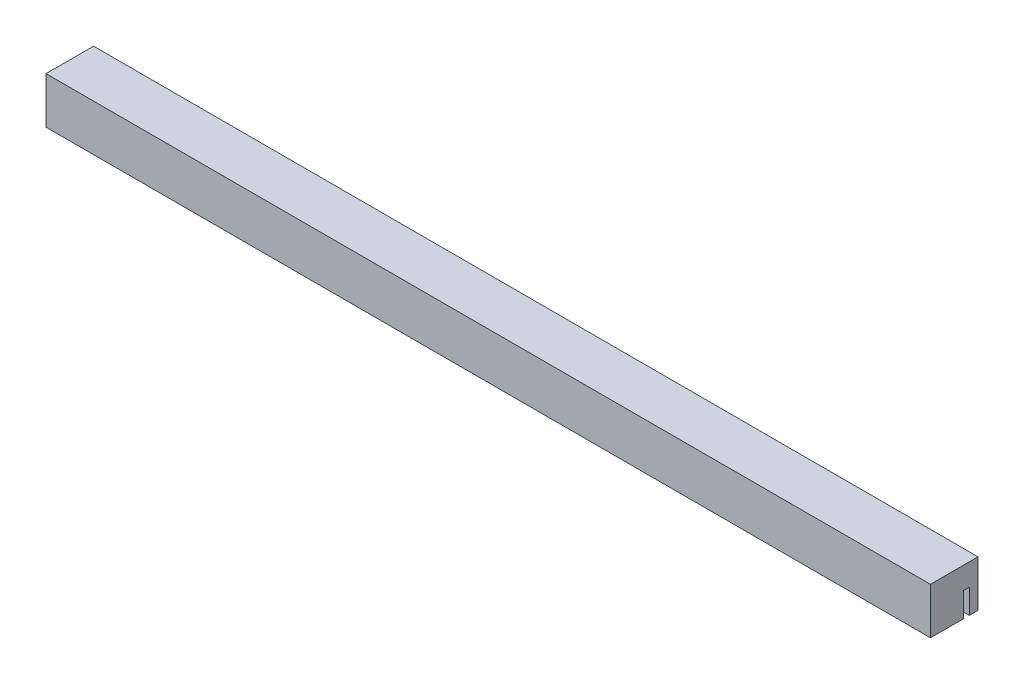
ISO-10303-21;
HEADER;
FILE_DESCRIPTION(('STEP AP214'),'2;1');
FILE_NAME('part.step','',(''),(''),'','','');
FILE_SCHEMA(('AUTOMOTIVE_DESIGN { 1 0 10303 214 1 1 1 1 }'));
ENDSEC;
DATA;
#1=APPLICATION_CONTEXT('core data for automotive mechanical design processes');
#2=APPLICATION_PROTOCOL_DEFINITION('international standard','automotive_design',2000,#1);
#3=PRODUCT_CONTEXT('',#1,'mechanical');
#4=PRODUCT('Part','Part','',(#3));
#5=PRODUCT_RELATED_PRODUCT_CATEGORY('part','',(#4));
#6=PRODUCT_DEFINITION_FORMATION('','',#4);
#7=PRODUCT_DEFINITION_CONTEXT('part definition',#1,'design');
#8=PRODUCT_DEFINITION('design','',#6,#7);
#9=PRODUCT_DEFINITION_SHAPE('','',#8);
#10=(LENGTH_UNIT() NAMED_UNIT(*) SI_UNIT(.MILLI.,.METRE.));
#11=(NAMED_UNIT(*) PLANE_ANGLE_UNIT() SI_UNIT($,.RADIAN.));
#12=(NAMED_UNIT(*) SI_UNIT($,.STERADIAN.) SOLID_ANGLE_UNIT());
#13=UNCERTAINTY_MEASURE_WITH_UNIT(LENGTH_MEASURE(1.E-05),#10,'distance_accuracy_value','');
#14=(GEOMETRIC_REPRESENTATION_CONTEXT(3) GLOBAL_UNCERTAINTY_ASSIGNED_CONTEXT((#13)) GLOBAL_UNIT_ASSIGNED_CONTEXT((#10,
#11,#12)) REPRESENTATION_CONTEXT('',''));
#15=CARTESIAN_POINT('',(0.,0.,0.));
#16=DIRECTION('',(0.,0.,1.));
#17=DIRECTION('',(1.,0.,0.));
#18=AXIS2_PLACEMENT_3D('',#15,#16,#17);
#19=CARTESIAN_POINT('',(-96.8375,-5.08,5.08));
#20=DIRECTION('',(0.,1.,0.));
#21=DIRECTION('',(0.,0.,1.));
#22=AXIS2_PLACEMENT_3D('',#19,#20,#21);
#23=PLANE('',#22);
#24=DIRECTION('',(0.,0.,-1.));
#25=VECTOR('',#24,1.);
#26=CARTESIAN_POINT('',(96.8375,-5.08,5.08));
#27=LINE('',#26,#25);
#28=CARTESIAN_POINT('',(96.8375,-5.08,1.905));
#29=VERTEX_POINT('',#28);
#30=CARTESIAN_POINT('',(96.8375,-5.08,0.));
#31=VERTEX_POINT('',#30);
#32=EDGE_CURVE('E59',#29,#31,#27,.T.);
#33=ORIENTED_EDGE('',*,*,#32,.F.);
#34=DIRECTION('',(1.,0.,0.));
#35=VECTOR('',#34,1.);
#36=CARTESIAN_POINT('',(96.8375,-5.08,1.905));
#37=LINE('',#36,#35);
#38=CARTESIAN_POINT('',(-96.8375,-5.08,1.90499999999998));
#39=VERTEX_POINT('',#38);
#40=EDGE_CURVE('E132',#39,#29,#37,.T.);
#41=ORIENTED_EDGE('',*,*,#40,.F.);
#42=DIRECTION('',(0.,0.,-1.));
#43=VECTOR('',#42,1.);
#44=CARTESIAN_POINT('',(-96.8375,-5.08,5.08));
#45=LINE('',#44,#43);
#46=CARTESIAN_POINT('',(-96.8375,-5.08,0.));
#47=VERTEX_POINT('',#46);
#48=EDGE_CURVE('E110',#39,#47,#45,.T.);
#49=ORIENTED_EDGE('',*,*,#48,.T.);
#50=DIRECTION('',(1.,0.,0.));
#51=VECTOR('',#50,1.);
#52=CARTESIAN_POINT('',(-96.8375,-5.08,0.));
#53=LINE('',#52,#51);
#54=EDGE_CURVE('E157',#47,#31,#53,.T.);
#55=ORIENTED_EDGE('',*,*,#54,.T.);
#56=EDGE_LOOP('',(#33,#41,#49,#55));
#57=FACE_BOUND('',#56,.T.);
#58=ADVANCED_FACE('F36',(#57),#23,.F.);
#59=CARTESIAN_POINT('',(96.8375,5.08,5.08));
#60=DIRECTION('',(-1.,0.,0.));
#61=DIRECTION('',(0.,0.,1.));
#62=AXIS2_PLACEMENT_3D('',#59,#60,#61);
#63=PLANE('',#62);
#64=DIRECTION('',(0.,0.,1.));
#65=VECTOR('',#64,1.);
#66=CARTESIAN_POINT('',(96.8375,0.253999999999999,3.175));
#67=LINE('',#66,#65);
#68=CARTESIAN_POINT('',(96.8375,0.253999999999999,1.905));
#69=VERTEX_POINT('',#68);
#70=CARTESIAN_POINT('',(96.8375,0.253999999999999,3.175));
#71=VERTEX_POINT('',#70);
#72=EDGE_CURVE('E128',#69,#71,#67,.T.);
#73=ORIENTED_EDGE('',*,*,#72,.F.);
#74=DIRECTION('',(0.,-1.,0.));
#75=VECTOR('',#74,1.);
#76=CARTESIAN_POINT('',(96.8375,0.253999999999999,1.905));
#77=LINE('',#76,#75);
#78=EDGE_CURVE('E142',#69,#29,#77,.T.);
#79=ORIENTED_EDGE('',*,*,#78,.T.);
#80=ORIENTED_EDGE('',*,*,#32,.T.);
#81=DIRECTION('',(0.,1.,0.));
#82=VECTOR('',#81,1.);
#83=CARTESIAN_POINT('',(96.8375,5.08,0.));
#84=LINE('',#83,#82);
#85=CARTESIAN_POINT('',(96.8375,5.08,0.));
#86=VERTEX_POINT('',#85);
#87=EDGE_CURVE('E144',#31,#86,#84,.T.);
#88=ORIENTED_EDGE('',*,*,#87,.T.);
#89=DIRECTION('',(0.,0.,-1.));
#90=VECTOR('',#89,1.);
#91=CARTESIAN_POINT('',(96.8375,5.08,5.08));
#92=LINE('',#91,#90);
#93=CARTESIAN_POINT('',(96.8375,5.08,10.414));
#94=VERTEX_POINT('',#93);
#95=EDGE_CURVE('E11',#94,#86,#92,.T.);
#96=ORIENTED_EDGE('',*,*,#95,.F.);
#97=DIRECTION('',(0.,1.,0.));
#98=VECTOR('',#97,1.);
#99=CARTESIAN_POINT('',(96.8375,-5.08,10.414));
#100=LINE('',#99,#98);
#101=CARTESIAN_POINT('',(96.8375,-5.08,10.414));
#102=VERTEX_POINT('',#101);
#103=EDGE_CURVE('E113',#102,#94,#100,.T.);
#104=ORIENTED_EDGE('',*,*,#103,.F.);
#105=CARTESIAN_POINT('',(96.8375,-5.08,3.17499999999999));
#106=VERTEX_POINT('',#105);
#107=EDGE_CURVE('E103',#102,#106,#27,.T.);
#108=ORIENTED_EDGE('',*,*,#107,.T.);
#109=DIRECTION('',(0.,-1.,0.));
#110=VECTOR('',#109,1.);
#111=CARTESIAN_POINT('',(96.8375,0.253999999999999,3.175));
#112=LINE('',#111,#110);
#113=EDGE_CURVE('E51',#71,#106,#112,.T.);
#114=ORIENTED_EDGE('',*,*,#113,.F.);
#115=EDGE_LOOP('',(#73,#79,#80,#88,#96,#104,#108,#114));
#116=FACE_BOUND('',#115,.T.);
#117=ADVANCED_FACE('F38',(#116),#63,.F.);
#118=CARTESIAN_POINT('',(-96.8375,5.08,5.08));
#119=DIRECTION('',(0.,-1.,0.));
#120=DIRECTION('',(0.,0.,-1.));
#121=AXIS2_PLACEMENT_3D('',#118,#119,#120);
#122=PLANE('',#121);
#123=DIRECTION('',(-1.,0.,0.));
#124=VECTOR('',#123,1.);
#125=CARTESIAN_POINT('',(-96.8375,5.08,0.));
#126=LINE('',#125,#124);
#127=CARTESIAN_POINT('',(-96.8375,5.08,0.));
#128=VERTEX_POINT('',#127);
#129=EDGE_CURVE('E152',#86,#128,#126,.T.);
#130=ORIENTED_EDGE('',*,*,#129,.T.);
#131=DIRECTION('',(0.,0.,-1.));
#132=VECTOR('',#131,1.);
#133=CARTESIAN_POINT('',(-96.8375,5.08,5.08));
#134=LINE('',#133,#132);
#135=CARTESIAN_POINT('',(-96.8375,5.08,10.414));
#136=VERTEX_POINT('',#135);
#137=EDGE_CURVE('E44',#136,#128,#134,.T.);
#138=ORIENTED_EDGE('',*,*,#137,.F.);
#139=DIRECTION('',(-1.,0.,0.));
#140=VECTOR('',#139,1.);
#141=CARTESIAN_POINT('',(96.8375,5.08,10.414));
#142=LINE('',#141,#140);
#143=EDGE_CURVE('E118',#94,#136,#142,.T.);
#144=ORIENTED_EDGE('',*,*,#143,.F.);
#145=ORIENTED_EDGE('',*,*,#95,.T.);
#146=EDGE_LOOP('',(#130,#138,#144,#145));
#147=FACE_BOUND('',#146,.T.);
#148=ADVANCED_FACE('F195',(#147),#122,.F.);
#149=CARTESIAN_POINT('',(-96.8375,5.08,5.08));
#150=DIRECTION('',(1.,0.,0.));
#151=DIRECTION('',(0.,0.,-1.));
#152=AXIS2_PLACEMENT_3D('',#149,#150,#151);
#153=PLANE('',#152);
#154=ORIENTED_EDGE('',*,*,#48,.F.);
#155=DIRECTION('',(0.,-1.,0.));
#156=VECTOR('',#155,1.);
#157=CARTESIAN_POINT('',(-96.8375,0.253999999999999,1.90499999999998));
#158=LINE('',#157,#156);
#159=CARTESIAN_POINT('',(-96.8375,0.253999999999999,1.90499999999998));
#160=VERTEX_POINT('',#159);
#161=EDGE_CURVE('E145',#160,#39,#158,.T.);
#162=ORIENTED_EDGE('',*,*,#161,.F.);
#163=DIRECTION('',(0.,0.,-1.));
#164=VECTOR('',#163,1.);
#165=CARTESIAN_POINT('',(-96.8375,0.253999999999999,3.17499999999998));
#166=LINE('',#165,#164);
#167=CARTESIAN_POINT('',(-96.8375,0.253999999999999,3.17499999999998));
#168=VERTEX_POINT('',#167);
#169=EDGE_CURVE('E135',#168,#160,#166,.T.);
#170=ORIENTED_EDGE('',*,*,#169,.F.);
#171=DIRECTION('',(0.,-1.,0.));
#172=VECTOR('',#171,1.);
#173=CARTESIAN_POINT('',(-96.8375,0.253999999999999,3.17499999999998));
#174=LINE('',#173,#172);
#175=CARTESIAN_POINT('',(-96.8375,-5.08,3.17499999999998));
#176=VERTEX_POINT('',#175);
#177=EDGE_CURVE('E147',#168,#176,#174,.T.);
#178=ORIENTED_EDGE('',*,*,#177,.T.);
#179=CARTESIAN_POINT('',(-96.8375,-5.08,10.414));
#180=VERTEX_POINT('',#179);
#181=EDGE_CURVE('E159',#180,#176,#45,.T.);
#182=ORIENTED_EDGE('',*,*,#181,.F.);
#183=DIRECTION('',(0.,-1.,0.));
#184=VECTOR('',#183,1.);
#185=CARTESIAN_POINT('',(-96.8375,5.08,10.414));
#186=LINE('',#185,#184);
#187=EDGE_CURVE('E123',#136,#180,#186,.T.);
#188=ORIENTED_EDGE('',*,*,#187,.F.);
#189=ORIENTED_EDGE('',*,*,#137,.T.);
#190=DIRECTION('',(0.,-1.,0.));
#191=VECTOR('',#190,1.);
#192=CARTESIAN_POINT('',(-96.8375,5.08,0.));
#193=LINE('',#192,#191);
#194=EDGE_CURVE('E154',#128,#47,#193,.T.);
#195=ORIENTED_EDGE('',*,*,#194,.T.);
#196=EDGE_LOOP('',(#154,#162,#170,#178,#182,#188,#189,#195));
#197=FACE_BOUND('',#196,.T.);
#198=ADVANCED_FACE('F164',(#197),#153,.F.);
#199=ORIENTED_EDGE('',*,*,#181,.T.);
#200=DIRECTION('',(-1.,0.,0.));
#201=VECTOR('',#200,1.);
#202=CARTESIAN_POINT('',(96.8375,-5.08,3.175));
#203=LINE('',#202,#201);
#204=EDGE_CURVE('E109',#106,#176,#203,.T.);
#205=ORIENTED_EDGE('',*,*,#204,.F.);
#206=ORIENTED_EDGE('',*,*,#107,.F.);
#207=DIRECTION('',(1.,0.,0.));
#208=VECTOR('',#207,1.);
#209=CARTESIAN_POINT('',(-96.8375,-5.08,10.414));
#210=LINE('',#209,#208);
#211=EDGE_CURVE('E108',#180,#102,#210,.T.);
#212=ORIENTED_EDGE('',*,*,#211,.F.);
#213=EDGE_LOOP('',(#199,#205,#206,#212));
#214=FACE_BOUND('',#213,.T.);
#215=ADVANCED_FACE('F106',(#214),#23,.F.);
#216=CARTESIAN_POINT('',(0.,0.,0.));
#217=DIRECTION('',(0.,0.,1.));
#218=DIRECTION('',(1.,0.,0.));
#219=AXIS2_PLACEMENT_3D('',#216,#217,#218);
#220=PLANE('',#219);
#221=ORIENTED_EDGE('',*,*,#87,.F.);
#222=ORIENTED_EDGE('',*,*,#54,.F.);
#223=ORIENTED_EDGE('',*,*,#194,.F.);
#224=ORIENTED_EDGE('',*,*,#129,.F.);
#225=EDGE_LOOP('',(#221,#222,#223,#224));
#226=FACE_BOUND('',#225,.T.);
#227=ADVANCED_FACE('F169',(#226),#220,.F.);
#228=CARTESIAN_POINT('',(96.8375,0.253999999999999,1.905));
#229=DIRECTION('',(0.,0.,-1.));
#230=DIRECTION('',(-1.,0.,0.));
#231=AXIS2_PLACEMENT_3D('',#228,#229,#230);
#232=PLANE('',#231);
#233=ORIENTED_EDGE('',*,*,#40,.T.);
#234=ORIENTED_EDGE('',*,*,#78,.F.);
#235=DIRECTION('',(1.,0.,0.));
#236=VECTOR('',#235,1.);
#237=CARTESIAN_POINT('',(96.8375,0.253999999999999,1.905));
#238=LINE('',#237,#236);
#239=EDGE_CURVE('E137',#160,#69,#238,.T.);
#240=ORIENTED_EDGE('',*,*,#239,.F.);
#241=ORIENTED_EDGE('',*,*,#161,.T.);
#242=EDGE_LOOP('',(#233,#234,#240,#241));
#243=FACE_BOUND('',#242,.T.);
#244=ADVANCED_FACE('F176',(#243),#232,.F.);
#245=CARTESIAN_POINT('',(96.8375,0.253999999999999,3.175));
#246=DIRECTION('',(0.,0.,1.));
#247=DIRECTION('',(1.,0.,0.));
#248=AXIS2_PLACEMENT_3D('',#245,#246,#247);
#249=PLANE('',#248);
#250=ORIENTED_EDGE('',*,*,#204,.T.);
#251=ORIENTED_EDGE('',*,*,#177,.F.);
#252=DIRECTION('',(-1.,0.,0.));
#253=VECTOR('',#252,1.);
#254=CARTESIAN_POINT('',(96.8375,0.253999999999999,3.175));
#255=LINE('',#254,#253);
#256=EDGE_CURVE('E131',#71,#168,#255,.T.);
#257=ORIENTED_EDGE('',*,*,#256,.F.);
#258=ORIENTED_EDGE('',*,*,#113,.T.);
#259=EDGE_LOOP('',(#250,#251,#257,#258));
#260=FACE_BOUND('',#259,.T.);
#261=ADVANCED_FACE('F179',(#260),#249,.F.);
#262=CARTESIAN_POINT('',(0.,0.253999999999999,0.));
#263=DIRECTION('',(0.,1.,0.));
#264=DIRECTION('',(0.,0.,1.));
#265=AXIS2_PLACEMENT_3D('',#262,#263,#264);
#266=PLANE('',#265);
#267=ORIENTED_EDGE('',*,*,#72,.T.);
#268=ORIENTED_EDGE('',*,*,#256,.T.);
#269=ORIENTED_EDGE('',*,*,#169,.T.);
#270=ORIENTED_EDGE('',*,*,#239,.T.);
#271=EDGE_LOOP('',(#267,#268,#269,#270));
#272=FACE_BOUND('',#271,.T.);
#273=ADVANCED_FACE('F178',(#272),#266,.F.);
#274=CARTESIAN_POINT('',(0.,0.,10.414));
#275=DIRECTION('',(0.,0.,1.));
#276=DIRECTION('',(1.,0.,0.));
#277=AXIS2_PLACEMENT_3D('',#274,#275,#276);
#278=PLANE('',#277);
#279=ORIENTED_EDGE('',*,*,#211,.T.);
#280=ORIENTED_EDGE('',*,*,#103,.T.);
#281=ORIENTED_EDGE('',*,*,#143,.T.);
#282=ORIENTED_EDGE('',*,*,#187,.T.);
#283=EDGE_LOOP('',(#279,#280,#281,#282));
#284=FACE_BOUND('',#283,.T.);
#285=ADVANCED_FACE('F121',(#284),#278,.T.);
#286=CLOSED_SHELL('',(#58,#117,#148,#198,#215,#227,#244,#261,#273,#285));
#287=MANIFOLD_SOLID_BREP('B2',#286);
#288=ADVANCED_BREP_SHAPE_REPRESENTATION('',(#18,#287),#14);
#289=SHAPE_DEFINITION_REPRESENTATION(#9,#288);
ENDSEC;
END-ISO-10303-21;
